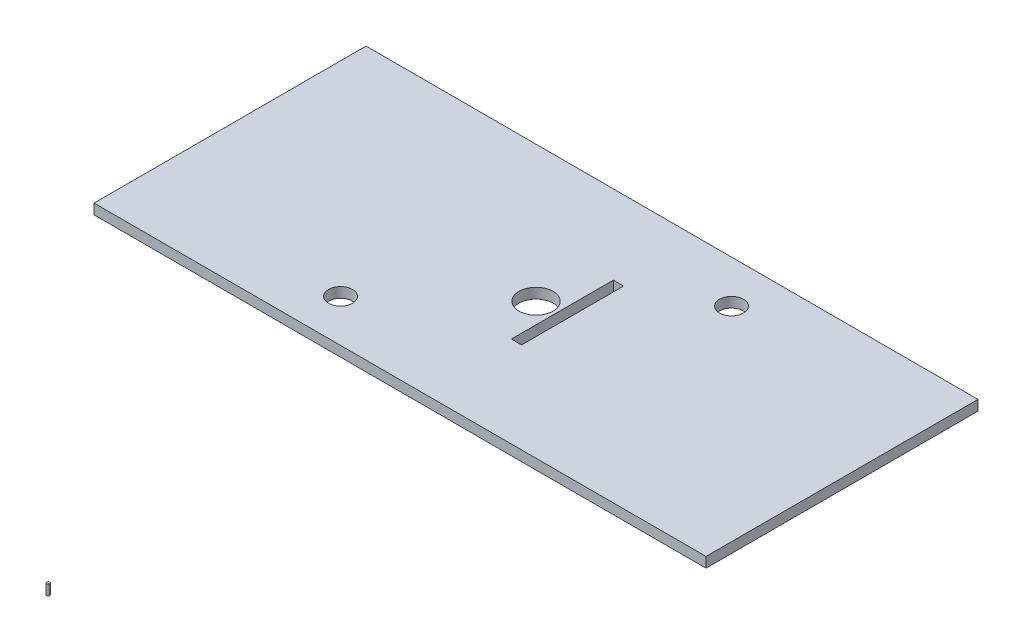
ISO-10303-21;
HEADER;
FILE_DESCRIPTION(('STEP AP214'),'2;1');
FILE_NAME('part.step','',(''),(''),'','','');
FILE_SCHEMA(('AUTOMOTIVE_DESIGN { 1 0 10303 214 1 1 1 1 }'));
ENDSEC;
DATA;
#1=APPLICATION_CONTEXT('core data for automotive mechanical design processes');
#2=APPLICATION_PROTOCOL_DEFINITION('international standard','automotive_design',2000,#1);
#3=PRODUCT_CONTEXT('',#1,'mechanical');
#4=PRODUCT('Part','Part','',(#3));
#5=PRODUCT_RELATED_PRODUCT_CATEGORY('part','',(#4));
#6=PRODUCT_DEFINITION_FORMATION('','',#4);
#7=PRODUCT_DEFINITION_CONTEXT('part definition',#1,'design');
#8=PRODUCT_DEFINITION('design','',#6,#7);
#9=PRODUCT_DEFINITION_SHAPE('','',#8);
#10=(LENGTH_UNIT() NAMED_UNIT(*) SI_UNIT(.MILLI.,.METRE.));
#11=(NAMED_UNIT(*) PLANE_ANGLE_UNIT() SI_UNIT($,.RADIAN.));
#12=(NAMED_UNIT(*) SI_UNIT($,.STERADIAN.) SOLID_ANGLE_UNIT());
#13=UNCERTAINTY_MEASURE_WITH_UNIT(LENGTH_MEASURE(1.E-05),#10,'distance_accuracy_value','');
#14=(GEOMETRIC_REPRESENTATION_CONTEXT(3) GLOBAL_UNCERTAINTY_ASSIGNED_CONTEXT((#13)) GLOBAL_UNIT_ASSIGNED_CONTEXT((#10,
#11,#12)) REPRESENTATION_CONTEXT('',''));
#15=CARTESIAN_POINT('',(0.,0.,0.));
#16=DIRECTION('',(0.,0.,1.));
#17=DIRECTION('',(1.,0.,0.));
#18=AXIS2_PLACEMENT_3D('',#15,#16,#17);
#19=CARTESIAN_POINT('',(0.,3.,143.5));
#20=DIRECTION('',(0.,-1.,0.));
#21=DIRECTION('',(0.,0.,-1.));
#22=AXIS2_PLACEMENT_3D('',#19,#20,#21);
#23=CYLINDRICAL_SURFACE('',#22,0.450000000000005);
#24=CARTESIAN_POINT('',(0.,3.,143.5));
#25=DIRECTION('',(0.,1.,0.));
#26=DIRECTION('',(0.,0.,1.));
#27=AXIS2_PLACEMENT_3D('',#24,#25,#26);
#28=CIRCLE('',#27,0.450000000000005);
#29=CARTESIAN_POINT('',(0.,3.,143.95));
#30=VERTEX_POINT('',#29);
#31=EDGE_CURVE('E56',#30,#30,#28,.T.);
#32=ORIENTED_EDGE('',*,*,#31,.F.);
#33=EDGE_LOOP('',(#32));
#34=FACE_BOUND('',#33,.T.);
#35=CARTESIAN_POINT('',(0.,0.,143.5));
#36=DIRECTION('',(0.,1.,0.));
#37=DIRECTION('',(0.,0.,1.));
#38=AXIS2_PLACEMENT_3D('',#35,#36,#37);
#39=CIRCLE('',#38,0.450000000000005);
#40=CARTESIAN_POINT('',(0.,0.,143.95));
#41=VERTEX_POINT('',#40);
#42=EDGE_CURVE('E11',#41,#41,#39,.T.);
#43=ORIENTED_EDGE('',*,*,#42,.T.);
#44=EDGE_LOOP('',(#43));
#45=FACE_BOUND('',#44,.T.);
#46=ADVANCED_FACE('F52',(#34,#45),#23,.T.);
#47=CARTESIAN_POINT('',(0.,3.,143.5));
#48=DIRECTION('',(0.,1.,0.));
#49=DIRECTION('',(0.,0.,1.));
#50=AXIS2_PLACEMENT_3D('',#47,#48,#49);
#51=PLANE('',#50);
#52=ORIENTED_EDGE('',*,*,#31,.T.);
#53=EDGE_LOOP('',(#52));
#54=FACE_BOUND('',#53,.T.);
#55=ADVANCED_FACE('F54',(#54),#51,.T.);
#56=CARTESIAN_POINT('',(0.,0.,143.5));
#57=DIRECTION('',(0.,1.,0.));
#58=DIRECTION('',(0.,0.,1.));
#59=AXIS2_PLACEMENT_3D('',#56,#57,#58);
#60=PLANE('',#59);
#61=ORIENTED_EDGE('',*,*,#42,.F.);
#62=EDGE_LOOP('',(#61));
#63=FACE_BOUND('',#62,.T.);
#64=ADVANCED_FACE('F71',(#63),#60,.F.);
#65=CLOSED_SHELL('',(#46,#55,#64));
#66=MANIFOLD_SOLID_BREP('B2',#65);
#67=CARTESIAN_POINT('',(0.,3.,0.));
#68=DIRECTION('',(0.,1.,0.));
#69=DIRECTION('',(0.,0.,1.));
#70=AXIS2_PLACEMENT_3D('',#67,#68,#69);
#71=PLANE('',#70);
#72=DIRECTION('',(0.,0.,-1.));
#73=VECTOR('',#72,1.);
#74=CARTESIAN_POINT('',(8.99999999999999,3.,-16.7480923361722));
#75=LINE('',#74,#73);
#76=CARTESIAN_POINT('',(9.00000000000001,3.,13.2519076638278));
#77=VERTEX_POINT('',#76);
#78=CARTESIAN_POINT('',(8.99999999999999,3.,-16.7480923361722));
#79=VERTEX_POINT('',#78);
#80=EDGE_CURVE('E108',#77,#79,#75,.T.);
#81=ORIENTED_EDGE('',*,*,#80,.F.);
#82=DIRECTION('',(1.,0.,0.));
#83=VECTOR('',#82,1.);
#84=CARTESIAN_POINT('',(6.,3.,13.2519076638278));
#85=LINE('',#84,#83);
#86=CARTESIAN_POINT('',(6.,3.,13.2519076638278));
#87=VERTEX_POINT('',#86);
#88=EDGE_CURVE('E178',#87,#77,#85,.T.);
#89=ORIENTED_EDGE('',*,*,#88,.F.);
#90=DIRECTION('',(0.,0.,1.));
#91=VECTOR('',#90,1.);
#92=CARTESIAN_POINT('',(5.99999999999999,3.,-16.7480923361722));
#93=LINE('',#92,#91);
#94=CARTESIAN_POINT('',(5.99999999999999,3.,-16.7480923361722));
#95=VERTEX_POINT('',#94);
#96=EDGE_CURVE('E161',#95,#87,#93,.T.);
#97=ORIENTED_EDGE('',*,*,#96,.F.);
#98=DIRECTION('',(-1.,0.,0.));
#99=VECTOR('',#98,1.);
#100=CARTESIAN_POINT('',(5.99999999999999,3.,-16.7480923361722));
#101=LINE('',#100,#99);
#102=EDGE_CURVE('E171',#79,#95,#101,.T.);
#103=ORIENTED_EDGE('',*,*,#102,.F.);
#104=EDGE_LOOP('',(#81,#89,#97,#103));
#105=FACE_BOUND('',#104,.T.);
#106=CARTESIAN_POINT('',(30.,3.,-27.5));
#107=DIRECTION('',(0.,1.,0.));
#108=DIRECTION('',(0.,0.,1.));
#109=AXIS2_PLACEMENT_3D('',#106,#107,#108);
#110=CIRCLE('',#109,3.525);
#111=CARTESIAN_POINT('',(30.,3.,-23.975));
#112=VERTEX_POINT('',#111);
#113=EDGE_CURVE('E193',#112,#112,#110,.T.);
#114=ORIENTED_EDGE('',*,*,#113,.F.);
#115=EDGE_LOOP('',(#114));
#116=FACE_BOUND('',#115,.T.);
#117=CARTESIAN_POINT('',(-30.,3.,27.5));
#118=DIRECTION('',(0.,1.,0.));
#119=DIRECTION('',(0.,0.,1.));
#120=AXIS2_PLACEMENT_3D('',#117,#118,#119);
#121=CIRCLE('',#120,3.525);
#122=CARTESIAN_POINT('',(-30.,3.,31.025));
#123=VERTEX_POINT('',#122);
#124=EDGE_CURVE('E188',#123,#123,#121,.T.);
#125=ORIENTED_EDGE('',*,*,#124,.F.);
#126=EDGE_LOOP('',(#125));
#127=FACE_BOUND('',#126,.T.);
#128=DIRECTION('',(0.,0.,1.));
#129=VECTOR('',#128,1.);
#130=CARTESIAN_POINT('',(-90.,3.,40.));
#131=LINE('',#130,#129);
#132=CARTESIAN_POINT('',(-90.,3.,-40.));
#133=VERTEX_POINT('',#132);
#134=CARTESIAN_POINT('',(-90.,3.,40.));
#135=VERTEX_POINT('',#134);
#136=EDGE_CURVE('E211',#133,#135,#131,.T.);
#137=ORIENTED_EDGE('',*,*,#136,.T.);
#138=DIRECTION('',(1.,0.,0.));
#139=VECTOR('',#138,1.);
#140=CARTESIAN_POINT('',(90.,3.,40.));
#141=LINE('',#140,#139);
#142=CARTESIAN_POINT('',(90.,3.,40.));
#143=VERTEX_POINT('',#142);
#144=EDGE_CURVE('E215',#135,#143,#141,.T.);
#145=ORIENTED_EDGE('',*,*,#144,.T.);
#146=DIRECTION('',(0.,0.,-1.));
#147=VECTOR('',#146,1.);
#148=CARTESIAN_POINT('',(90.,3.,40.));
#149=LINE('',#148,#147);
#150=CARTESIAN_POINT('',(90.,3.,-40.));
#151=VERTEX_POINT('',#150);
#152=EDGE_CURVE('E219',#143,#151,#149,.T.);
#153=ORIENTED_EDGE('',*,*,#152,.T.);
#154=DIRECTION('',(-1.,0.,0.));
#155=VECTOR('',#154,1.);
#156=CARTESIAN_POINT('',(90.,3.,-40.));
#157=LINE('',#156,#155);
#158=EDGE_CURVE('E222',#151,#133,#157,.T.);
#159=ORIENTED_EDGE('',*,*,#158,.T.);
#160=EDGE_LOOP('',(#137,#145,#153,#159));
#161=FACE_BOUND('',#160,.T.);
#162=CARTESIAN_POINT('',(0.,3.,0.));
#163=DIRECTION('',(0.,1.,0.));
#164=DIRECTION('',(0.,0.,1.));
#165=AXIS2_PLACEMENT_3D('',#162,#163,#164);
#166=CIRCLE('',#165,5.025);
#167=CARTESIAN_POINT('',(0.,3.,5.025));
#168=VERTEX_POINT('',#167);
#169=EDGE_CURVE('E201',#168,#168,#166,.T.);
#170=ORIENTED_EDGE('',*,*,#169,.F.);
#171=EDGE_LOOP('',(#170));
#172=FACE_BOUND('',#171,.T.);
#173=ADVANCED_FACE('F92',(#105,#116,#127,#161,#172),#71,.T.);
#174=CARTESIAN_POINT('',(0.,0.,0.));
#175=DIRECTION('',(0.,1.,0.));
#176=DIRECTION('',(0.,0.,1.));
#177=AXIS2_PLACEMENT_3D('',#174,#175,#176);
#178=PLANE('',#177);
#179=DIRECTION('',(1.,0.,0.));
#180=VECTOR('',#179,1.);
#181=CARTESIAN_POINT('',(0.,0.,13.2519076638278));
#182=LINE('',#181,#180);
#183=CARTESIAN_POINT('',(6.,0.,13.2519076638278));
#184=VERTEX_POINT('',#183);
#185=CARTESIAN_POINT('',(9.00000000000001,0.,13.2519076638278));
#186=VERTEX_POINT('',#185);
#187=EDGE_CURVE('E101',#184,#186,#182,.T.);
#188=ORIENTED_EDGE('',*,*,#187,.T.);
#189=DIRECTION('',(0.,0.,-1.));
#190=VECTOR('',#189,1.);
#191=CARTESIAN_POINT('',(9.,0.,0.));
#192=LINE('',#191,#190);
#193=CARTESIAN_POINT('',(8.99999999999999,0.,-16.7480923361722));
#194=VERTEX_POINT('',#193);
#195=EDGE_CURVE('E50',#186,#194,#192,.T.);
#196=ORIENTED_EDGE('',*,*,#195,.T.);
#197=DIRECTION('',(-1.,0.,0.));
#198=VECTOR('',#197,1.);
#199=CARTESIAN_POINT('',(0.,0.,-16.7480923361722));
#200=LINE('',#199,#198);
#201=CARTESIAN_POINT('',(5.99999999999999,0.,-16.7480923361722));
#202=VERTEX_POINT('',#201);
#203=EDGE_CURVE('E252',#194,#202,#200,.T.);
#204=ORIENTED_EDGE('',*,*,#203,.T.);
#205=DIRECTION('',(0.,0.,1.));
#206=VECTOR('',#205,1.);
#207=CARTESIAN_POINT('',(6.,0.,0.));
#208=LINE('',#207,#206);
#209=EDGE_CURVE('E164',#202,#184,#208,.T.);
#210=ORIENTED_EDGE('',*,*,#209,.T.);
#211=EDGE_LOOP('',(#188,#196,#204,#210));
#212=FACE_BOUND('',#211,.T.);
#213=CARTESIAN_POINT('',(30.,0.,-27.5));
#214=DIRECTION('',(0.,1.,0.));
#215=DIRECTION('',(0.,0.,1.));
#216=AXIS2_PLACEMENT_3D('',#213,#214,#215);
#217=CIRCLE('',#216,3.525);
#218=CARTESIAN_POINT('',(30.,0.,-23.975));
#219=VERTEX_POINT('',#218);
#220=EDGE_CURVE('E210',#219,#219,#217,.T.);
#221=ORIENTED_EDGE('',*,*,#220,.T.);
#222=EDGE_LOOP('',(#221));
#223=FACE_BOUND('',#222,.T.);
#224=CARTESIAN_POINT('',(-30.,0.,27.5));
#225=DIRECTION('',(0.,1.,0.));
#226=DIRECTION('',(0.,0.,1.));
#227=AXIS2_PLACEMENT_3D('',#224,#225,#226);
#228=CIRCLE('',#227,3.525);
#229=CARTESIAN_POINT('',(-30.,0.,31.025));
#230=VERTEX_POINT('',#229);
#231=EDGE_CURVE('E197',#230,#230,#228,.T.);
#232=ORIENTED_EDGE('',*,*,#231,.T.);
#233=EDGE_LOOP('',(#232));
#234=FACE_BOUND('',#233,.T.);
#235=DIRECTION('',(0.,0.,1.));
#236=VECTOR('',#235,1.);
#237=CARTESIAN_POINT('',(-90.,0.,40.));
#238=LINE('',#237,#236);
#239=CARTESIAN_POINT('',(-90.,0.,-40.));
#240=VERTEX_POINT('',#239);
#241=CARTESIAN_POINT('',(-90.,0.,40.));
#242=VERTEX_POINT('',#241);
#243=EDGE_CURVE('E205',#240,#242,#238,.T.);
#244=ORIENTED_EDGE('',*,*,#243,.F.);
#245=DIRECTION('',(-1.,0.,0.));
#246=VECTOR('',#245,1.);
#247=CARTESIAN_POINT('',(90.,0.,-40.));
#248=LINE('',#247,#246);
#249=CARTESIAN_POINT('',(90.,0.,-40.));
#250=VERTEX_POINT('',#249);
#251=EDGE_CURVE('E216',#250,#240,#248,.T.);
#252=ORIENTED_EDGE('',*,*,#251,.F.);
#253=DIRECTION('',(0.,0.,-1.));
#254=VECTOR('',#253,1.);
#255=CARTESIAN_POINT('',(90.,0.,40.));
#256=LINE('',#255,#254);
#257=CARTESIAN_POINT('',(90.,0.,40.));
#258=VERTEX_POINT('',#257);
#259=EDGE_CURVE('E232',#258,#250,#256,.T.);
#260=ORIENTED_EDGE('',*,*,#259,.F.);
#261=DIRECTION('',(1.,0.,0.));
#262=VECTOR('',#261,1.);
#263=CARTESIAN_POINT('',(90.,0.,40.));
#264=LINE('',#263,#262);
#265=EDGE_CURVE('E229',#242,#258,#264,.T.);
#266=ORIENTED_EDGE('',*,*,#265,.F.);
#267=EDGE_LOOP('',(#244,#252,#260,#266));
#268=FACE_BOUND('',#267,.T.);
#269=CARTESIAN_POINT('',(0.,0.,0.));
#270=DIRECTION('',(0.,1.,0.));
#271=DIRECTION('',(0.,0.,1.));
#272=AXIS2_PLACEMENT_3D('',#269,#270,#271);
#273=CIRCLE('',#272,5.025);
#274=CARTESIAN_POINT('',(0.,0.,5.025));
#275=VERTEX_POINT('',#274);
#276=EDGE_CURVE('E206',#275,#275,#273,.T.);
#277=ORIENTED_EDGE('',*,*,#276,.T.);
#278=EDGE_LOOP('',(#277));
#279=FACE_BOUND('',#278,.T.);
#280=ADVANCED_FACE('F265',(#212,#223,#234,#268,#279),#178,.F.);
#281=CARTESIAN_POINT('',(-90.,3.,40.));
#282=DIRECTION('',(1.,0.,0.));
#283=DIRECTION('',(0.,0.,-1.));
#284=AXIS2_PLACEMENT_3D('',#281,#282,#283);
#285=PLANE('',#284);
#286=ORIENTED_EDGE('',*,*,#243,.T.);
#287=DIRECTION('',(0.,-1.,0.));
#288=VECTOR('',#287,1.);
#289=CARTESIAN_POINT('',(-90.,3.,40.));
#290=LINE('',#289,#288);
#291=EDGE_CURVE('E248',#135,#242,#290,.T.);
#292=ORIENTED_EDGE('',*,*,#291,.F.);
#293=ORIENTED_EDGE('',*,*,#136,.F.);
#294=DIRECTION('',(0.,-1.,0.));
#295=VECTOR('',#294,1.);
#296=CARTESIAN_POINT('',(-90.,3.,-40.));
#297=LINE('',#296,#295);
#298=EDGE_CURVE('E225',#133,#240,#297,.T.);
#299=ORIENTED_EDGE('',*,*,#298,.T.);
#300=EDGE_LOOP('',(#286,#292,#293,#299));
#301=FACE_BOUND('',#300,.T.);
#302=ADVANCED_FACE('F94',(#301),#285,.F.);
#303=CARTESIAN_POINT('',(90.,3.,40.));
#304=DIRECTION('',(0.,0.,-1.));
#305=DIRECTION('',(-1.,0.,0.));
#306=AXIS2_PLACEMENT_3D('',#303,#304,#305);
#307=PLANE('',#306);
#308=ORIENTED_EDGE('',*,*,#265,.T.);
#309=DIRECTION('',(0.,-1.,0.));
#310=VECTOR('',#309,1.);
#311=CARTESIAN_POINT('',(90.,3.,40.));
#312=LINE('',#311,#310);
#313=EDGE_CURVE('E244',#143,#258,#312,.T.);
#314=ORIENTED_EDGE('',*,*,#313,.F.);
#315=ORIENTED_EDGE('',*,*,#144,.F.);
#316=ORIENTED_EDGE('',*,*,#291,.T.);
#317=EDGE_LOOP('',(#308,#314,#315,#316));
#318=FACE_BOUND('',#317,.T.);
#319=ADVANCED_FACE('F299',(#318),#307,.F.);
#320=CARTESIAN_POINT('',(90.,3.,40.));
#321=DIRECTION('',(-1.,0.,0.));
#322=DIRECTION('',(0.,0.,1.));
#323=AXIS2_PLACEMENT_3D('',#320,#321,#322);
#324=PLANE('',#323);
#325=ORIENTED_EDGE('',*,*,#259,.T.);
#326=DIRECTION('',(0.,-1.,0.));
#327=VECTOR('',#326,1.);
#328=CARTESIAN_POINT('',(90.,3.,-40.));
#329=LINE('',#328,#327);
#330=EDGE_CURVE('E240',#151,#250,#329,.T.);
#331=ORIENTED_EDGE('',*,*,#330,.F.);
#332=ORIENTED_EDGE('',*,*,#152,.F.);
#333=ORIENTED_EDGE('',*,*,#313,.T.);
#334=EDGE_LOOP('',(#325,#331,#332,#333));
#335=FACE_BOUND('',#334,.T.);
#336=ADVANCED_FACE('F296',(#335),#324,.F.);
#337=CARTESIAN_POINT('',(90.,3.,-40.));
#338=DIRECTION('',(0.,0.,1.));
#339=DIRECTION('',(1.,0.,0.));
#340=AXIS2_PLACEMENT_3D('',#337,#338,#339);
#341=PLANE('',#340);
#342=ORIENTED_EDGE('',*,*,#251,.T.);
#343=ORIENTED_EDGE('',*,*,#298,.F.);
#344=ORIENTED_EDGE('',*,*,#158,.F.);
#345=ORIENTED_EDGE('',*,*,#330,.T.);
#346=EDGE_LOOP('',(#342,#343,#344,#345));
#347=FACE_BOUND('',#346,.T.);
#348=ADVANCED_FACE('F293',(#347),#341,.F.);
#349=CARTESIAN_POINT('',(0.,3.,0.));
#350=DIRECTION('',(0.,-1.,0.));
#351=DIRECTION('',(0.,0.,-1.));
#352=AXIS2_PLACEMENT_3D('',#349,#350,#351);
#353=CYLINDRICAL_SURFACE('',#352,5.025);
#354=ORIENTED_EDGE('',*,*,#169,.T.);
#355=EDGE_LOOP('',(#354));
#356=FACE_BOUND('',#355,.T.);
#357=ORIENTED_EDGE('',*,*,#276,.F.);
#358=EDGE_LOOP('',(#357));
#359=FACE_BOUND('',#358,.T.);
#360=ADVANCED_FACE('F290',(#356,#359),#353,.F.);
#361=CARTESIAN_POINT('',(-30.,-97.,27.5));
#362=DIRECTION('',(0.,1.,0.));
#363=DIRECTION('',(0.,0.,1.));
#364=AXIS2_PLACEMENT_3D('',#361,#362,#363);
#365=CYLINDRICAL_SURFACE('',#364,3.525);
#366=ORIENTED_EDGE('',*,*,#124,.T.);
#367=EDGE_LOOP('',(#366));
#368=FACE_BOUND('',#367,.T.);
#369=ORIENTED_EDGE('',*,*,#231,.F.);
#370=EDGE_LOOP('',(#369));
#371=FACE_BOUND('',#370,.T.);
#372=ADVANCED_FACE('F280',(#368,#371),#365,.F.);
#373=CARTESIAN_POINT('',(30.,-97.,-27.5));
#374=DIRECTION('',(0.,1.,0.));
#375=DIRECTION('',(0.,0.,1.));
#376=AXIS2_PLACEMENT_3D('',#373,#374,#375);
#377=CYLINDRICAL_SURFACE('',#376,3.525);
#378=ORIENTED_EDGE('',*,*,#113,.T.);
#379=EDGE_LOOP('',(#378));
#380=FACE_BOUND('',#379,.T.);
#381=ORIENTED_EDGE('',*,*,#220,.F.);
#382=EDGE_LOOP('',(#381));
#383=FACE_BOUND('',#382,.T.);
#384=ADVANCED_FACE('F272',(#380,#383),#377,.F.);
#385=CARTESIAN_POINT('',(8.99999999999999,-7.,-16.7480923361722));
#386=DIRECTION('',(1.,0.,0.));
#387=DIRECTION('',(0.,0.,-1.));
#388=AXIS2_PLACEMENT_3D('',#385,#386,#387);
#389=PLANE('',#388);
#390=DIRECTION('',(0.,1.,0.));
#391=VECTOR('',#390,1.);
#392=CARTESIAN_POINT('',(9.00000000000001,-7.,13.2519076638278));
#393=LINE('',#392,#391);
#394=EDGE_CURVE('E185',#186,#77,#393,.T.);
#395=ORIENTED_EDGE('',*,*,#394,.T.);
#396=ORIENTED_EDGE('',*,*,#80,.T.);
#397=DIRECTION('',(0.,1.,0.));
#398=VECTOR('',#397,1.);
#399=CARTESIAN_POINT('',(8.99999999999999,-7.,-16.7480923361722));
#400=LINE('',#399,#398);
#401=EDGE_CURVE('E168',#194,#79,#400,.T.);
#402=ORIENTED_EDGE('',*,*,#401,.F.);
#403=ORIENTED_EDGE('',*,*,#195,.F.);
#404=EDGE_LOOP('',(#395,#396,#402,#403));
#405=FACE_BOUND('',#404,.T.);
#406=ADVANCED_FACE('F270',(#405),#389,.F.);
#407=CARTESIAN_POINT('',(6.,-7.,13.2519076638278));
#408=DIRECTION('',(0.,0.,1.));
#409=DIRECTION('',(1.,0.,0.));
#410=AXIS2_PLACEMENT_3D('',#407,#408,#409);
#411=PLANE('',#410);
#412=DIRECTION('',(0.,1.,0.));
#413=VECTOR('',#412,1.);
#414=CARTESIAN_POINT('',(6.,-7.,13.2519076638278));
#415=LINE('',#414,#413);
#416=EDGE_CURVE('E167',#184,#87,#415,.T.);
#417=ORIENTED_EDGE('',*,*,#416,.T.);
#418=ORIENTED_EDGE('',*,*,#88,.T.);
#419=ORIENTED_EDGE('',*,*,#394,.F.);
#420=ORIENTED_EDGE('',*,*,#187,.F.);
#421=EDGE_LOOP('',(#417,#418,#419,#420));
#422=FACE_BOUND('',#421,.T.);
#423=ADVANCED_FACE('F269',(#422),#411,.F.);
#424=CARTESIAN_POINT('',(5.99999999999999,-7.,-16.7480923361722));
#425=DIRECTION('',(-1.,0.,0.));
#426=DIRECTION('',(0.,0.,1.));
#427=AXIS2_PLACEMENT_3D('',#424,#425,#426);
#428=PLANE('',#427);
#429=DIRECTION('',(0.,1.,0.));
#430=VECTOR('',#429,1.);
#431=CARTESIAN_POINT('',(5.99999999999999,-7.,-16.7480923361722));
#432=LINE('',#431,#430);
#433=EDGE_CURVE('E116',#202,#95,#432,.T.);
#434=ORIENTED_EDGE('',*,*,#433,.T.);
#435=ORIENTED_EDGE('',*,*,#96,.T.);
#436=ORIENTED_EDGE('',*,*,#416,.F.);
#437=ORIENTED_EDGE('',*,*,#209,.F.);
#438=EDGE_LOOP('',(#434,#435,#436,#437));
#439=FACE_BOUND('',#438,.T.);
#440=ADVANCED_FACE('F158',(#439),#428,.F.);
#441=CARTESIAN_POINT('',(5.99999999999999,-7.,-16.7480923361722));
#442=DIRECTION('',(0.,0.,-1.));
#443=DIRECTION('',(-1.,0.,0.));
#444=AXIS2_PLACEMENT_3D('',#441,#442,#443);
#445=PLANE('',#444);
#446=ORIENTED_EDGE('',*,*,#401,.T.);
#447=ORIENTED_EDGE('',*,*,#102,.T.);
#448=ORIENTED_EDGE('',*,*,#433,.F.);
#449=ORIENTED_EDGE('',*,*,#203,.F.);
#450=EDGE_LOOP('',(#446,#447,#448,#449));
#451=FACE_BOUND('',#450,.T.);
#452=ADVANCED_FACE('F172',(#451),#445,.F.);
#453=CLOSED_SHELL('',(#173,#280,#302,#319,#336,#348,#360,#372,#384,#406,#423,#440,#452));
#454=MANIFOLD_SOLID_BREP('B6',#453);
#455=ADVANCED_BREP_SHAPE_REPRESENTATION('',(#18,#66,#454),#14);
#456=SHAPE_DEFINITION_REPRESENTATION(#9,#455);
ENDSEC;
END-ISO-10303-21;
